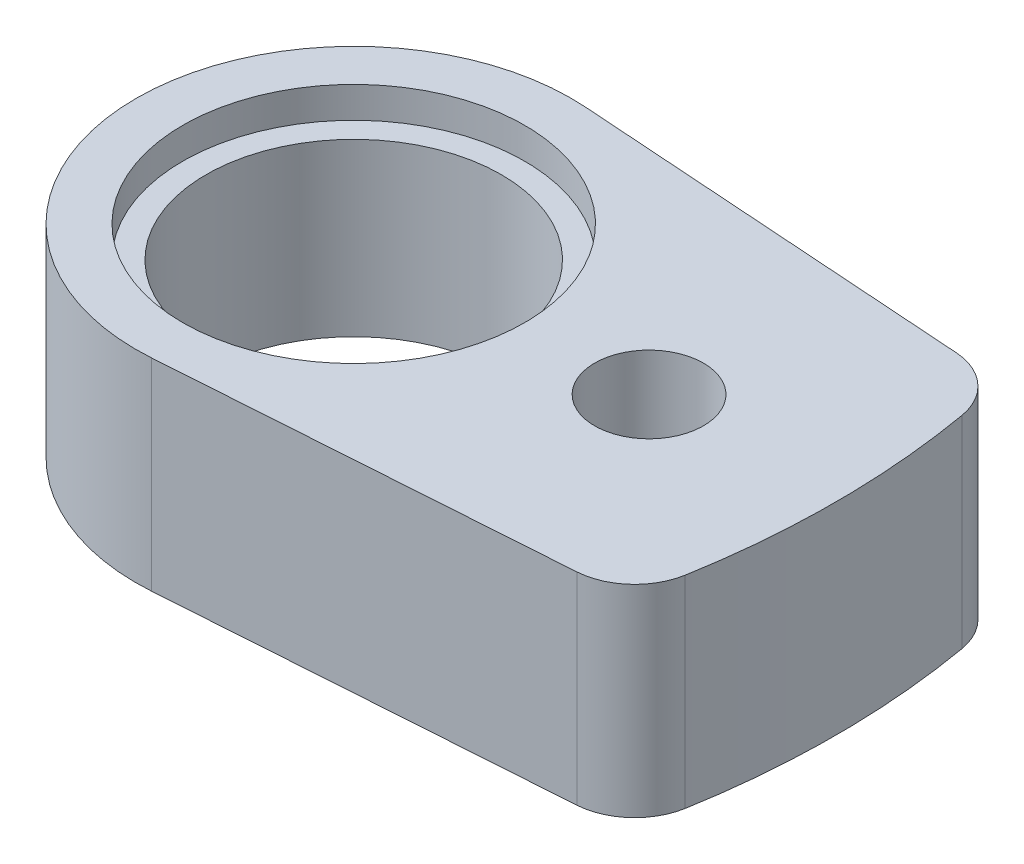
ISO-10303-21;
HEADER;
FILE_DESCRIPTION(('STEP AP214'),'2;1');
FILE_NAME('part.step','',(''),(''),'','','');
FILE_SCHEMA(('AUTOMOTIVE_DESIGN { 1 0 10303 214 1 1 1 1 }'));
ENDSEC;
DATA;
#1=APPLICATION_CONTEXT('core data for automotive mechanical design processes');
#2=APPLICATION_PROTOCOL_DEFINITION('international standard','automotive_design',2000,#1);
#3=PRODUCT_CONTEXT('',#1,'mechanical');
#4=PRODUCT('Part','Part','',(#3));
#5=PRODUCT_RELATED_PRODUCT_CATEGORY('part','',(#4));
#6=PRODUCT_DEFINITION_FORMATION('','',#4);
#7=PRODUCT_DEFINITION_CONTEXT('part definition',#1,'design');
#8=PRODUCT_DEFINITION('design','',#6,#7);
#9=PRODUCT_DEFINITION_SHAPE('','',#8);
#10=(LENGTH_UNIT() NAMED_UNIT(*) SI_UNIT(.MILLI.,.METRE.));
#11=(NAMED_UNIT(*) PLANE_ANGLE_UNIT() SI_UNIT($,.RADIAN.));
#12=(NAMED_UNIT(*) SI_UNIT($,.STERADIAN.) SOLID_ANGLE_UNIT());
#13=UNCERTAINTY_MEASURE_WITH_UNIT(LENGTH_MEASURE(1.E-05),#10,'distance_accuracy_value','');
#14=(GEOMETRIC_REPRESENTATION_CONTEXT(3) GLOBAL_UNCERTAINTY_ASSIGNED_CONTEXT((#13)) GLOBAL_UNIT_ASSIGNED_CONTEXT((#10,
#11,#12)) REPRESENTATION_CONTEXT('',''));
#15=CARTESIAN_POINT('',(0.,0.,0.));
#16=DIRECTION('',(0.,0.,1.));
#17=DIRECTION('',(1.,0.,0.));
#18=AXIS2_PLACEMENT_3D('',#15,#16,#17);
#19=CARTESIAN_POINT('',(0.,13.,0.));
#20=DIRECTION('',(0.,-1.,0.));
#21=DIRECTION('',(0.,0.,-1.));
#22=AXIS2_PLACEMENT_3D('',#19,#20,#21);
#23=CYLINDRICAL_SURFACE('',#22,9.5);
#24=CARTESIAN_POINT('',(0.,0.,0.));
#25=DIRECTION('',(0.,1.,0.));
#26=DIRECTION('',(0.,0.,1.));
#27=AXIS2_PLACEMENT_3D('',#24,#25,#26);
#28=CIRCLE('',#27,9.5);
#29=CARTESIAN_POINT('',(0.,0.,-9.5));
#30=VERTEX_POINT('',#29);
#31=EDGE_CURVE('E141',#30,#30,#28,.T.);
#32=CARTESIAN_POINT('',(0.,11.,0.));
#33=DIRECTION('',(0.,1.,0.));
#34=DIRECTION('',(0.,0.,1.));
#35=AXIS2_PLACEMENT_3D('',#32,#33,#34);
#36=CIRCLE('',#35,9.5);
#37=CARTESIAN_POINT('',(0.,11.,-9.5));
#38=VERTEX_POINT('',#37);
#39=EDGE_CURVE('E36',#38,#38,#36,.T.);
#40=CARTESIAN_POINT('',(0.,0.,-9.5));
#41=CARTESIAN_POINT('',(0.,0.114583333333334,-9.5));
#42=CARTESIAN_POINT('',(0.,0.229166666666667,-9.5));
#43=CARTESIAN_POINT('',(0.,0.458333333333334,-9.5));
#44=CARTESIAN_POINT('',(0.,0.572916666666667,-9.5));
#45=CARTESIAN_POINT('',(0.,0.802083333333334,-9.5));
#46=CARTESIAN_POINT('',(0.,0.916666666666668,-9.5));
#47=CARTESIAN_POINT('',(0.,1.14583333333333,-9.5));
#48=CARTESIAN_POINT('',(0.,1.26041666666667,-9.5));
#49=CARTESIAN_POINT('',(0.,1.48958333333333,-9.5));
#50=CARTESIAN_POINT('',(0.,1.60416666666667,-9.5));
#51=CARTESIAN_POINT('',(0.,1.83333333333333,-9.5));
#52=CARTESIAN_POINT('',(0.,1.94791666666667,-9.5));
#53=CARTESIAN_POINT('',(0.,2.17708333333333,-9.5));
#54=CARTESIAN_POINT('',(0.,2.29166666666667,-9.5));
#55=CARTESIAN_POINT('',(0.,2.52083333333333,-9.5));
#56=CARTESIAN_POINT('',(0.,2.63541666666667,-9.5));
#57=CARTESIAN_POINT('',(0.,2.86458333333333,-9.5));
#58=CARTESIAN_POINT('',(0.,2.97916666666667,-9.5));
#59=CARTESIAN_POINT('',(0.,3.20833333333333,-9.5));
#60=CARTESIAN_POINT('',(0.,3.32291666666667,-9.5));
#61=CARTESIAN_POINT('',(0.,3.55208333333333,-9.5));
#62=CARTESIAN_POINT('',(0.,3.66666666666667,-9.5));
#63=CARTESIAN_POINT('',(0.,3.89583333333333,-9.5));
#64=CARTESIAN_POINT('',(0.,4.01041666666667,-9.5));
#65=CARTESIAN_POINT('',(0.,4.23958333333333,-9.5));
#66=CARTESIAN_POINT('',(0.,4.35416666666667,-9.5));
#67=CARTESIAN_POINT('',(0.,4.58333333333333,-9.5));
#68=CARTESIAN_POINT('',(0.,4.69791666666667,-9.5));
#69=CARTESIAN_POINT('',(0.,4.92708333333333,-9.5));
#70=CARTESIAN_POINT('',(0.,5.04166666666667,-9.5));
#71=CARTESIAN_POINT('',(0.,5.27083333333333,-9.5));
#72=CARTESIAN_POINT('',(0.,5.38541666666667,-9.5));
#73=CARTESIAN_POINT('',(0.,5.61458333333333,-9.5));
#74=CARTESIAN_POINT('',(0.,5.72916666666667,-9.5));
#75=CARTESIAN_POINT('',(0.,5.95833333333333,-9.5));
#76=CARTESIAN_POINT('',(0.,6.07291666666667,-9.5));
#77=CARTESIAN_POINT('',(0.,6.30208333333333,-9.5));
#78=CARTESIAN_POINT('',(0.,6.41666666666667,-9.5));
#79=CARTESIAN_POINT('',(0.,6.64583333333333,-9.5));
#80=CARTESIAN_POINT('',(0.,6.76041666666667,-9.5));
#81=CARTESIAN_POINT('',(0.,6.98958333333333,-9.5));
#82=CARTESIAN_POINT('',(0.,7.10416666666667,-9.5));
#83=CARTESIAN_POINT('',(0.,7.33333333333333,-9.5));
#84=CARTESIAN_POINT('',(0.,7.44791666666667,-9.5));
#85=CARTESIAN_POINT('',(0.,7.67708333333333,-9.5));
#86=CARTESIAN_POINT('',(0.,7.79166666666667,-9.5));
#87=CARTESIAN_POINT('',(0.,8.02083333333333,-9.5));
#88=CARTESIAN_POINT('',(0.,8.13541666666667,-9.5));
#89=CARTESIAN_POINT('',(0.,8.36458333333333,-9.5));
#90=CARTESIAN_POINT('',(0.,8.47916666666666,-9.5));
#91=CARTESIAN_POINT('',(0.,8.70833333333333,-9.5));
#92=CARTESIAN_POINT('',(0.,8.82291666666666,-9.5));
#93=CARTESIAN_POINT('',(0.,9.05208333333333,-9.5));
#94=CARTESIAN_POINT('',(0.,9.16666666666666,-9.5));
#95=CARTESIAN_POINT('',(0.,9.39583333333333,-9.5));
#96=CARTESIAN_POINT('',(0.,9.51041666666667,-9.5));
#97=CARTESIAN_POINT('',(0.,9.73958333333333,-9.5));
#98=CARTESIAN_POINT('',(0.,9.85416666666667,-9.5));
#99=CARTESIAN_POINT('',(0.,10.0833333333333,-9.5));
#100=CARTESIAN_POINT('',(0.,10.1979166666667,-9.5));
#101=CARTESIAN_POINT('',(0.,10.4270833333333,-9.5));
#102=CARTESIAN_POINT('',(0.,10.5416666666667,-9.5));
#103=CARTESIAN_POINT('',(0.,10.7708333333333,-9.5));
#104=CARTESIAN_POINT('',(0.,10.8854166666667,-9.5));
#105=CARTESIAN_POINT('',(0.,11.,-9.5));
#106=B_SPLINE_CURVE_WITH_KNOTS('',3,(#40,#41,#42,#43,#44,#45,#46,#47,#48,#49,#50,#51,#52,#53,
#54,#55,#56,#57,#58,#59,#60,#61,#62,#63,#64,#65,#66,#67,#68,#69,#70,#71,#72,#73,#74,#75,#76,#77,
#78,#79,#80,#81,#82,#83,#84,#85,#86,#87,#88,#89,#90,#91,#92,#93,#94,#95,#96,#97,#98,#99,#100,
#101,#102,#103,#104,#105),.UNSPECIFIED.,.F.,.F.,(4,2,2,2,2,2,2,2,2,2,2,2,2,2,2,2,2,2,2,2,2,2,2,
2,2,2,2,2,2,2,2,2,4),(0.,0.34375,0.687500000000001,1.03125,1.375,1.71875,2.0625,2.40625,2.75,
3.09375,3.4375,3.78125,4.125,4.46875,4.8125,5.15625,5.5,5.84375,6.1875,6.53125,6.875,7.21875,
7.5625,7.90625,8.25,8.59375,8.9375,9.28125,9.625,9.96875,10.3125,10.65625,11.),.UNSPECIFIED.);
#107=EDGE_CURVE('BSEAM32',#30,#38,#106,.T.);
#108=ORIENTED_EDGE('',*,*,#31,.F.);
#109=ORIENTED_EDGE('',*,*,#39,.T.);
#110=ORIENTED_EDGE('',*,*,#107,.T.);
#111=ORIENTED_EDGE('',*,*,#107,.F.);
#112=EDGE_LOOP('',(#108,#110,#109,#111));
#113=FACE_BOUND('',#112,.T.);
#114=ADVANCED_FACE('F32',(#113),#23,.F.);
#115=CARTESIAN_POINT('',(0.,13.,0.));
#116=DIRECTION('',(0.,-1.,0.));
#117=DIRECTION('',(0.,0.,-1.));
#118=AXIS2_PLACEMENT_3D('',#115,#116,#117);
#119=PLANE('',#118);
#120=CARTESIAN_POINT('',(0.,13.,0.));
#121=DIRECTION('',(0.,1.,0.));
#122=DIRECTION('',(0.,0.,1.));
#123=AXIS2_PLACEMENT_3D('',#120,#121,#122);
#124=CIRCLE('',#123,11.);
#125=CARTESIAN_POINT('',(0.,13.,11.));
#126=VERTEX_POINT('',#125);
#127=EDGE_CURVE('E247',#126,#126,#124,.T.);
#128=ORIENTED_EDGE('',*,*,#127,.F.);
#129=EDGE_LOOP('',(#128));
#130=FACE_BOUND('',#129,.T.);
#131=DIRECTION('',(0.997649134583669,0.,-0.0685288571658445));
#132=VECTOR('',#131,1.);
#133=CARTESIAN_POINT('',(29.5964425626941,13.,12.));
#134=LINE('',#133,#132);
#135=CARTESIAN_POINT('',(0.95940400032182,13.,13.9670878841714));
#136=VERTEX_POINT('',#135);
#137=CARTESIAN_POINT('',(26.5654571623432,13.,12.2081994143754));
#138=VERTEX_POINT('',#137);
#139=EDGE_CURVE('E86',#136,#138,#134,.T.);
#140=ORIENTED_EDGE('',*,*,#139,.T.);
#141=CARTESIAN_POINT('',(26.2913417336798,13.,8.21760287604068));
#142=DIRECTION('',(0.,-1.,0.));
#143=DIRECTION('',(0.,0.,-1.));
#144=AXIS2_PLACEMENT_3D('',#141,#142,#143);
#145=CIRCLE('',#144,4.);
#146=CARTESIAN_POINT('',(30.2322868781532,13.,8.90240311571074));
#147=VERTEX_POINT('',#146);
#148=EDGE_CURVE('E41',#138,#147,#145,.F.);
#149=ORIENTED_EDGE('',*,*,#148,.T.);
#150=CARTESIAN_POINT('',(-21.,13.,0.));
#151=DIRECTION('',(0.,1.,0.));
#152=DIRECTION('',(0.,0.,-1.));
#153=AXIS2_PLACEMENT_3D('',#150,#151,#152);
#154=CIRCLE('',#153,52.);
#155=CARTESIAN_POINT('',(30.2322868781532,13.,-8.90240311571074));
#156=VERTEX_POINT('',#155);
#157=EDGE_CURVE('E93',#147,#156,#154,.T.);
#158=ORIENTED_EDGE('',*,*,#157,.T.);
#159=CARTESIAN_POINT('',(26.2913417336798,13.,-8.21760287604068));
#160=DIRECTION('',(0.,-1.,0.));
#161=DIRECTION('',(0.,0.,-1.));
#162=AXIS2_PLACEMENT_3D('',#159,#160,#161);
#163=CIRCLE('',#162,4.);
#164=CARTESIAN_POINT('',(26.5654571623432,13.,-12.2081994143754));
#165=VERTEX_POINT('',#164);
#166=EDGE_CURVE('E48',#156,#165,#163,.F.);
#167=ORIENTED_EDGE('',*,*,#166,.T.);
#168=DIRECTION('',(-0.997649134583669,0.,-0.0685288571658445));
#169=VECTOR('',#168,1.);
#170=CARTESIAN_POINT('',(0.95940400032182,13.,-13.9670878841714));
#171=LINE('',#170,#169);
#172=CARTESIAN_POINT('',(0.95940400032182,13.,-13.9670878841714));
#173=VERTEX_POINT('',#172);
#174=EDGE_CURVE('E99',#165,#173,#171,.T.);
#175=ORIENTED_EDGE('',*,*,#174,.T.);
#176=CARTESIAN_POINT('',(0.,13.,0.));
#177=DIRECTION('',(0.,1.,0.));
#178=DIRECTION('',(0.,0.,-1.));
#179=AXIS2_PLACEMENT_3D('',#176,#177,#178);
#180=CIRCLE('',#179,14.);
#181=EDGE_CURVE('E94',#173,#136,#180,.T.);
#182=ORIENTED_EDGE('',*,*,#181,.T.);
#183=EDGE_LOOP('',(#140,#149,#158,#167,#175,#182));
#184=FACE_BOUND('',#183,.T.);
#185=CARTESIAN_POINT('',(19.,13.,0.));
#186=DIRECTION('',(0.,1.,0.));
#187=DIRECTION('',(0.,0.,1.));
#188=AXIS2_PLACEMENT_3D('',#185,#186,#187);
#189=CIRCLE('',#188,3.50000000000001);
#190=CARTESIAN_POINT('',(19.,13.,-3.50000000000001));
#191=VERTEX_POINT('',#190);
#192=EDGE_CURVE('E253',#191,#191,#189,.T.);
#193=ORIENTED_EDGE('',*,*,#192,.F.);
#194=EDGE_LOOP('',(#193));
#195=FACE_BOUND('',#194,.T.);
#196=ADVANCED_FACE('F97',(#130,#184,#195),#119,.F.);
#197=CARTESIAN_POINT('',(0.,0.,0.));
#198=DIRECTION('',(0.,-1.,0.));
#199=DIRECTION('',(0.,0.,-1.));
#200=AXIS2_PLACEMENT_3D('',#197,#198,#199);
#201=PLANE('',#200);
#202=ORIENTED_EDGE('',*,*,#31,.T.);
#203=EDGE_LOOP('',(#202));
#204=FACE_BOUND('',#203,.T.);
#205=CARTESIAN_POINT('',(-21.,0.,0.));
#206=DIRECTION('',(0.,1.,0.));
#207=DIRECTION('',(0.,0.,-1.));
#208=AXIS2_PLACEMENT_3D('',#205,#206,#207);
#209=CIRCLE('',#208,52.);
#210=CARTESIAN_POINT('',(30.2322868781532,0.,8.90240311571074));
#211=VERTEX_POINT('',#210);
#212=CARTESIAN_POINT('',(30.2322868781532,0.,-8.90240311571074));
#213=VERTEX_POINT('',#212);
#214=EDGE_CURVE('E138',#211,#213,#209,.T.);
#215=ORIENTED_EDGE('',*,*,#214,.F.);
#216=CARTESIAN_POINT('',(26.2913417336798,0.,8.21760287604068));
#217=DIRECTION('',(0.,-1.,0.));
#218=DIRECTION('',(0.,0.,-1.));
#219=AXIS2_PLACEMENT_3D('',#216,#217,#218);
#220=CIRCLE('',#219,4.);
#221=CARTESIAN_POINT('',(26.5654571623432,0.,12.2081994143754));
#222=VERTEX_POINT('',#221);
#223=EDGE_CURVE('E120',#211,#222,#220,.T.);
#224=ORIENTED_EDGE('',*,*,#223,.T.);
#225=DIRECTION('',(0.997649134583669,0.,-0.0685288571658445));
#226=VECTOR('',#225,1.);
#227=CARTESIAN_POINT('',(29.5964425626941,0.,12.));
#228=LINE('',#227,#226);
#229=CARTESIAN_POINT('',(0.95940400032182,0.,13.9670878841714));
#230=VERTEX_POINT('',#229);
#231=EDGE_CURVE('E137',#230,#222,#228,.T.);
#232=ORIENTED_EDGE('',*,*,#231,.F.);
#233=CARTESIAN_POINT('',(0.,0.,0.));
#234=DIRECTION('',(0.,1.,0.));
#235=DIRECTION('',(0.,0.,-1.));
#236=AXIS2_PLACEMENT_3D('',#233,#234,#235);
#237=CIRCLE('',#236,14.);
#238=CARTESIAN_POINT('',(0.95940400032182,0.,-13.9670878841714));
#239=VERTEX_POINT('',#238);
#240=EDGE_CURVE('E107',#239,#230,#237,.T.);
#241=ORIENTED_EDGE('',*,*,#240,.F.);
#242=DIRECTION('',(-0.997649134583669,0.,-0.0685288571658445));
#243=VECTOR('',#242,1.);
#244=CARTESIAN_POINT('',(0.95940400032182,0.,-13.9670878841714));
#245=LINE('',#244,#243);
#246=CARTESIAN_POINT('',(26.5654571623432,0.,-12.2081994143754));
#247=VERTEX_POINT('',#246);
#248=EDGE_CURVE('E103',#247,#239,#245,.T.);
#249=ORIENTED_EDGE('',*,*,#248,.F.);
#250=CARTESIAN_POINT('',(26.2913417336798,0.,-8.21760287604068));
#251=DIRECTION('',(0.,-1.,0.));
#252=DIRECTION('',(0.,0.,-1.));
#253=AXIS2_PLACEMENT_3D('',#250,#251,#252);
#254=CIRCLE('',#253,4.);
#255=EDGE_CURVE('E118',#247,#213,#254,.T.);
#256=ORIENTED_EDGE('',*,*,#255,.T.);
#257=EDGE_LOOP('',(#215,#224,#232,#241,#249,#256));
#258=FACE_BOUND('',#257,.T.);
#259=CARTESIAN_POINT('',(19.,0.,0.));
#260=DIRECTION('',(0.,1.,0.));
#261=DIRECTION('',(0.,0.,1.));
#262=AXIS2_PLACEMENT_3D('',#259,#260,#261);
#263=CIRCLE('',#262,3.50000000000001);
#264=CARTESIAN_POINT('',(19.,0.,-3.50000000000001));
#265=VERTEX_POINT('',#264);
#266=EDGE_CURVE('E249',#265,#265,#263,.T.);
#267=ORIENTED_EDGE('',*,*,#266,.T.);
#268=EDGE_LOOP('',(#267));
#269=FACE_BOUND('',#268,.T.);
#270=ADVANCED_FACE('F135',(#204,#258,#269),#201,.T.);
#271=CARTESIAN_POINT('',(0.,13.,0.));
#272=DIRECTION('',(0.,-1.,0.));
#273=DIRECTION('',(0.,0.,-1.));
#274=AXIS2_PLACEMENT_3D('',#271,#272,#273);
#275=CYLINDRICAL_SURFACE('',#274,14.);
#276=ORIENTED_EDGE('',*,*,#240,.T.);
#277=DIRECTION('',(0.,-1.,0.));
#278=VECTOR('',#277,1.);
#279=CARTESIAN_POINT('',(0.95940400032182,13.,13.9670878841714));
#280=LINE('',#279,#278);
#281=EDGE_CURVE('E90',#136,#230,#280,.T.);
#282=ORIENTED_EDGE('',*,*,#281,.F.);
#283=ORIENTED_EDGE('',*,*,#181,.F.);
#284=DIRECTION('',(0.,-1.,0.));
#285=VECTOR('',#284,1.);
#286=CARTESIAN_POINT('',(0.95940400032182,13.,-13.9670878841714));
#287=LINE('',#286,#285);
#288=EDGE_CURVE('E109',#173,#239,#287,.T.);
#289=ORIENTED_EDGE('',*,*,#288,.T.);
#290=EDGE_LOOP('',(#276,#282,#283,#289));
#291=FACE_BOUND('',#290,.T.);
#292=ADVANCED_FACE('F105',(#291),#275,.T.);
#293=CARTESIAN_POINT('',(29.5964425626941,13.,12.));
#294=DIRECTION('',(-0.0685288571658445,0.,-0.997649134583669));
#295=DIRECTION('',(-0.997649134583669,0.,0.0685288571658445));
#296=AXIS2_PLACEMENT_3D('',#293,#294,#295);
#297=PLANE('',#296);
#298=ORIENTED_EDGE('',*,*,#231,.T.);
#299=DIRECTION('',(0.,-1.,0.));
#300=VECTOR('',#299,1.);
#301=CARTESIAN_POINT('',(26.5654571623432,13.,12.2081994143754));
#302=LINE('',#301,#300);
#303=EDGE_CURVE('E56',#222,#138,#302,.F.);
#304=ORIENTED_EDGE('',*,*,#303,.T.);
#305=ORIENTED_EDGE('',*,*,#139,.F.);
#306=ORIENTED_EDGE('',*,*,#281,.T.);
#307=EDGE_LOOP('',(#298,#304,#305,#306));
#308=FACE_BOUND('',#307,.T.);
#309=ADVANCED_FACE('F88',(#308),#297,.F.);
#310=CARTESIAN_POINT('',(-21.,13.,0.));
#311=DIRECTION('',(0.,-1.,0.));
#312=DIRECTION('',(0.,0.,-1.));
#313=AXIS2_PLACEMENT_3D('',#310,#311,#312);
#314=CYLINDRICAL_SURFACE('',#313,52.);
#315=ORIENTED_EDGE('',*,*,#157,.F.);
#316=DIRECTION('',(0.,-1.,0.));
#317=VECTOR('',#316,1.);
#318=CARTESIAN_POINT('',(30.2322868781532,13.,8.90240311571074));
#319=LINE('',#318,#317);
#320=EDGE_CURVE('E111',#147,#211,#319,.T.);
#321=ORIENTED_EDGE('',*,*,#320,.T.);
#322=ORIENTED_EDGE('',*,*,#214,.T.);
#323=DIRECTION('',(0.,-1.,0.));
#324=VECTOR('',#323,1.);
#325=CARTESIAN_POINT('',(30.2322868781532,13.,-8.90240311571074));
#326=LINE('',#325,#324);
#327=EDGE_CURVE('E108',#213,#156,#326,.F.);
#328=ORIENTED_EDGE('',*,*,#327,.T.);
#329=EDGE_LOOP('',(#315,#321,#322,#328));
#330=FACE_BOUND('',#329,.T.);
#331=ADVANCED_FACE('F128',(#330),#314,.T.);
#332=CARTESIAN_POINT('',(0.95940400032182,13.,-13.9670878841714));
#333=DIRECTION('',(-0.0685288571658445,0.,0.997649134583669));
#334=DIRECTION('',(0.997649134583669,0.,0.0685288571658445));
#335=AXIS2_PLACEMENT_3D('',#332,#333,#334);
#336=PLANE('',#335);
#337=ORIENTED_EDGE('',*,*,#174,.F.);
#338=DIRECTION('',(0.,-1.,0.));
#339=VECTOR('',#338,1.);
#340=CARTESIAN_POINT('',(26.5654571623432,13.,-12.2081994143754));
#341=LINE('',#340,#339);
#342=EDGE_CURVE('E11',#165,#247,#341,.T.);
#343=ORIENTED_EDGE('',*,*,#342,.T.);
#344=ORIENTED_EDGE('',*,*,#248,.T.);
#345=ORIENTED_EDGE('',*,*,#288,.F.);
#346=EDGE_LOOP('',(#337,#343,#344,#345));
#347=FACE_BOUND('',#346,.T.);
#348=ADVANCED_FACE('F146',(#347),#336,.F.);
#349=CARTESIAN_POINT('',(19.,13.,0.));
#350=DIRECTION('',(0.,-1.,0.));
#351=DIRECTION('',(0.,0.,-1.));
#352=AXIS2_PLACEMENT_3D('',#349,#350,#351);
#353=CYLINDRICAL_SURFACE('',#352,3.50000000000001);
#354=CARTESIAN_POINT('',(19.,13.,-3.50000000000001));
#355=CARTESIAN_POINT('',(19.,12.8645833333333,-3.50000000000001));
#356=CARTESIAN_POINT('',(19.,12.7291666666667,-3.50000000000001));
#357=CARTESIAN_POINT('',(19.,12.4583333333333,-3.50000000000001));
#358=CARTESIAN_POINT('',(19.,12.3229166666667,-3.50000000000001));
#359=CARTESIAN_POINT('',(19.,12.0520833333333,-3.50000000000001));
#360=CARTESIAN_POINT('',(19.,11.9166666666667,-3.50000000000001));
#361=CARTESIAN_POINT('',(19.,11.6458333333333,-3.50000000000001));
#362=CARTESIAN_POINT('',(19.,11.5104166666667,-3.50000000000001));
#363=CARTESIAN_POINT('',(19.,11.2395833333333,-3.50000000000001));
#364=CARTESIAN_POINT('',(19.,11.1041666666667,-3.50000000000001));
#365=CARTESIAN_POINT('',(19.,10.8333333333333,-3.50000000000001));
#366=CARTESIAN_POINT('',(19.,10.6979166666667,-3.50000000000001));
#367=CARTESIAN_POINT('',(19.,10.4270833333333,-3.50000000000001));
#368=CARTESIAN_POINT('',(19.,10.2916666666667,-3.50000000000001));
#369=CARTESIAN_POINT('',(19.,10.0208333333333,-3.50000000000001));
#370=CARTESIAN_POINT('',(19.,9.88541666666667,-3.50000000000001));
#371=CARTESIAN_POINT('',(19.,9.61458333333333,-3.50000000000001));
#372=CARTESIAN_POINT('',(19.,9.47916666666667,-3.50000000000001));
#373=CARTESIAN_POINT('',(19.,9.20833333333333,-3.50000000000001));
#374=CARTESIAN_POINT('',(19.,9.07291666666667,-3.50000000000001));
#375=CARTESIAN_POINT('',(19.,8.80208333333333,-3.50000000000001));
#376=CARTESIAN_POINT('',(19.,8.66666666666667,-3.50000000000001));
#377=CARTESIAN_POINT('',(19.,8.39583333333333,-3.50000000000001));
#378=CARTESIAN_POINT('',(19.,8.26041666666667,-3.50000000000001));
#379=CARTESIAN_POINT('',(19.,7.98958333333333,-3.50000000000001));
#380=CARTESIAN_POINT('',(19.,7.85416666666667,-3.50000000000001));
#381=CARTESIAN_POINT('',(19.,7.58333333333333,-3.50000000000001));
#382=CARTESIAN_POINT('',(19.,7.44791666666667,-3.50000000000001));
#383=CARTESIAN_POINT('',(19.,7.17708333333333,-3.50000000000001));
#384=CARTESIAN_POINT('',(19.,7.04166666666667,-3.50000000000001));
#385=CARTESIAN_POINT('',(19.,6.77083333333333,-3.50000000000001));
#386=CARTESIAN_POINT('',(19.,6.63541666666667,-3.50000000000001));
#387=CARTESIAN_POINT('',(19.,6.36458333333333,-3.50000000000001));
#388=CARTESIAN_POINT('',(19.,6.22916666666667,-3.50000000000001));
#389=CARTESIAN_POINT('',(19.,5.95833333333333,-3.50000000000001));
#390=CARTESIAN_POINT('',(19.,5.82291666666667,-3.50000000000001));
#391=CARTESIAN_POINT('',(19.,5.55208333333333,-3.50000000000001));
#392=CARTESIAN_POINT('',(19.,5.41666666666667,-3.50000000000001));
#393=CARTESIAN_POINT('',(19.,5.14583333333333,-3.50000000000001));
#394=CARTESIAN_POINT('',(19.,5.01041666666667,-3.50000000000001));
#395=CARTESIAN_POINT('',(19.,4.73958333333333,-3.50000000000001));
#396=CARTESIAN_POINT('',(19.,4.60416666666667,-3.50000000000001));
#397=CARTESIAN_POINT('',(19.,4.33333333333333,-3.50000000000001));
#398=CARTESIAN_POINT('',(19.,4.19791666666667,-3.50000000000001));
#399=CARTESIAN_POINT('',(19.,3.92708333333333,-3.50000000000001));
#400=CARTESIAN_POINT('',(19.,3.79166666666667,-3.50000000000001));
#401=CARTESIAN_POINT('',(19.,3.52083333333333,-3.50000000000001));
#402=CARTESIAN_POINT('',(19.,3.38541666666667,-3.50000000000001));
#403=CARTESIAN_POINT('',(19.,3.11458333333333,-3.50000000000001));
#404=CARTESIAN_POINT('',(19.,2.97916666666667,-3.50000000000001));
#405=CARTESIAN_POINT('',(19.,2.70833333333333,-3.50000000000001));
#406=CARTESIAN_POINT('',(19.,2.57291666666667,-3.50000000000001));
#407=CARTESIAN_POINT('',(19.,2.30208333333333,-3.50000000000001));
#408=CARTESIAN_POINT('',(19.,2.16666666666667,-3.50000000000001));
#409=CARTESIAN_POINT('',(19.,1.89583333333333,-3.50000000000001));
#410=CARTESIAN_POINT('',(19.,1.76041666666667,-3.50000000000001));
#411=CARTESIAN_POINT('',(19.,1.48958333333333,-3.50000000000001));
#412=CARTESIAN_POINT('',(19.,1.35416666666667,-3.50000000000001));
#413=CARTESIAN_POINT('',(19.,1.08333333333333,-3.50000000000001));
#414=CARTESIAN_POINT('',(19.,0.947916666666667,-3.50000000000001));
#415=CARTESIAN_POINT('',(19.,0.677083333333334,-3.50000000000001));
#416=CARTESIAN_POINT('',(19.,0.541666666666667,-3.50000000000001));
#417=CARTESIAN_POINT('',(19.,0.270833333333334,-3.50000000000001));
#418=CARTESIAN_POINT('',(19.,0.135416666666667,-3.50000000000001));
#419=CARTESIAN_POINT('',(19.,0.,-3.50000000000001));
#420=B_SPLINE_CURVE_WITH_KNOTS('',3,(#354,#355,#356,#357,#358,#359,#360,#361,#362,#363,#364,
#365,#366,#367,#368,#369,#370,#371,#372,#373,#374,#375,#376,#377,#378,#379,#380,#381,#382,#383,
#384,#385,#386,#387,#388,#389,#390,#391,#392,#393,#394,#395,#396,#397,#398,#399,#400,#401,#402,
#403,#404,#405,#406,#407,#408,#409,#410,#411,#412,#413,#414,#415,#416,#417,#418,#419),
.UNSPECIFIED.,.F.,.F.,(4,2,2,2,2,2,2,2,2,2,2,2,2,2,2,2,2,2,2,2,2,2,2,2,2,2,2,2,2,2,2,2,4),(0.,
0.406249999999999,0.812499999999999,1.21875,1.625,2.03125,2.4375,2.84375,3.25,3.65625,4.0625,
4.46875,4.875,5.28125,5.6875,6.09375,6.5,6.90625,7.3125,7.71875,8.125,8.53125,8.9375,9.34375,
9.75,10.15625,10.5625,10.96875,11.375,11.78125,12.1875,12.59375,13.),.UNSPECIFIED.);
#421=EDGE_CURVE('BSEAM158',#191,#265,#420,.T.);
#422=ORIENTED_EDGE('',*,*,#192,.T.);
#423=ORIENTED_EDGE('',*,*,#266,.F.);
#424=ORIENTED_EDGE('',*,*,#421,.T.);
#425=ORIENTED_EDGE('',*,*,#421,.F.);
#426=EDGE_LOOP('',(#422,#424,#423,#425));
#427=FACE_BOUND('',#426,.T.);
#428=ADVANCED_FACE('F158',(#427),#353,.F.);
#429=CARTESIAN_POINT('',(26.2913417336798,13.,8.21760287604068));
#430=DIRECTION('',(0.,-1.,0.));
#431=DIRECTION('',(0.,0.,-1.));
#432=AXIS2_PLACEMENT_3D('',#429,#430,#431);
#433=CYLINDRICAL_SURFACE('',#432,4.);
#434=ORIENTED_EDGE('',*,*,#148,.F.);
#435=ORIENTED_EDGE('',*,*,#303,.F.);
#436=ORIENTED_EDGE('',*,*,#223,.F.);
#437=ORIENTED_EDGE('',*,*,#320,.F.);
#438=EDGE_LOOP('',(#434,#435,#436,#437));
#439=FACE_BOUND('',#438,.T.);
#440=ADVANCED_FACE('F133',(#439),#433,.T.);
#441=CARTESIAN_POINT('',(26.2913417336798,13.,-8.21760287604068));
#442=DIRECTION('',(0.,-1.,0.));
#443=DIRECTION('',(0.,0.,-1.));
#444=AXIS2_PLACEMENT_3D('',#441,#442,#443);
#445=CYLINDRICAL_SURFACE('',#444,4.);
#446=ORIENTED_EDGE('',*,*,#166,.F.);
#447=ORIENTED_EDGE('',*,*,#327,.F.);
#448=ORIENTED_EDGE('',*,*,#255,.F.);
#449=ORIENTED_EDGE('',*,*,#342,.F.);
#450=EDGE_LOOP('',(#446,#447,#448,#449));
#451=FACE_BOUND('',#450,.T.);
#452=ADVANCED_FACE('F34',(#451),#445,.T.);
#453=CARTESIAN_POINT('',(0.,11.,0.));
#454=DIRECTION('',(0.,1.,0.));
#455=DIRECTION('',(0.,0.,1.));
#456=AXIS2_PLACEMENT_3D('',#453,#454,#455);
#457=CYLINDRICAL_SURFACE('',#456,11.);
#458=CARTESIAN_POINT('',(0.,11.,0.));
#459=DIRECTION('',(0.,1.,0.));
#460=DIRECTION('',(0.,0.,1.));
#461=AXIS2_PLACEMENT_3D('',#458,#459,#460);
#462=CIRCLE('',#461,11.);
#463=CARTESIAN_POINT('',(0.,11.,11.));
#464=VERTEX_POINT('',#463);
#465=EDGE_CURVE('E246',#464,#464,#462,.T.);
#466=ORIENTED_EDGE('',*,*,#465,.F.);
#467=EDGE_LOOP('',(#466));
#468=FACE_BOUND('',#467,.T.);
#469=ORIENTED_EDGE('',*,*,#127,.T.);
#470=EDGE_LOOP('',(#469));
#471=FACE_BOUND('',#470,.T.);
#472=ADVANCED_FACE('F150',(#468,#471),#457,.F.);
#473=CARTESIAN_POINT('',(0.,11.,0.));
#474=DIRECTION('',(0.,1.,0.));
#475=DIRECTION('',(0.,0.,1.));
#476=AXIS2_PLACEMENT_3D('',#473,#474,#475);
#477=PLANE('',#476);
#478=ORIENTED_EDGE('',*,*,#39,.F.);
#479=EDGE_LOOP('',(#478));
#480=FACE_BOUND('',#479,.T.);
#481=ORIENTED_EDGE('',*,*,#465,.T.);
#482=EDGE_LOOP('',(#481));
#483=FACE_BOUND('',#482,.T.);
#484=ADVANCED_FACE('F155',(#480,#483),#477,.T.);
#485=CLOSED_SHELL('',(#114,#196,#270,#292,#309,#331,#348,#428,#440,#452,#472,#484));
#486=MANIFOLD_SOLID_BREP('B2',#485);
#487=ADVANCED_BREP_SHAPE_REPRESENTATION('',(#18,#486),#14);
#488=SHAPE_DEFINITION_REPRESENTATION(#9,#487);
ENDSEC;
END-ISO-10303-21;
